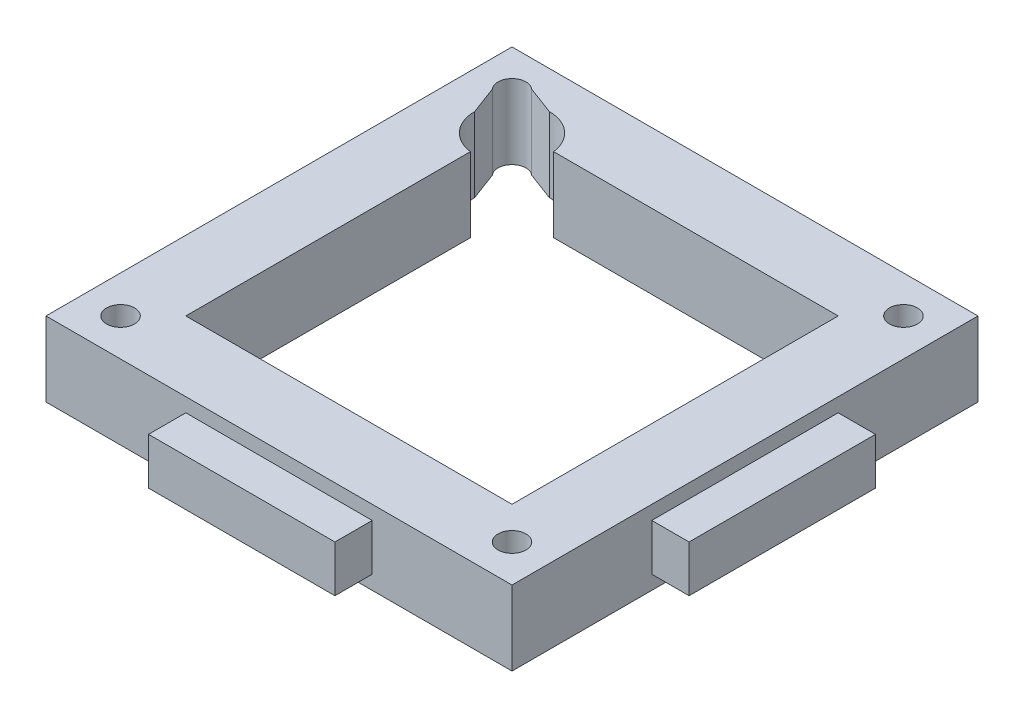
ISO-10303-21;
HEADER;
FILE_DESCRIPTION(('STEP AP214'),'2;1');
FILE_NAME('part.step','',(''),(''),'','','');
FILE_SCHEMA(('AUTOMOTIVE_DESIGN { 1 0 10303 214 1 1 1 1 }'));
ENDSEC;
DATA;
#1=APPLICATION_CONTEXT('core data for automotive mechanical design processes');
#2=APPLICATION_PROTOCOL_DEFINITION('international standard','automotive_design',2000,#1);
#3=PRODUCT_CONTEXT('',#1,'mechanical');
#4=PRODUCT('Part','Part','',(#3));
#5=PRODUCT_RELATED_PRODUCT_CATEGORY('part','',(#4));
#6=PRODUCT_DEFINITION_FORMATION('','',#4);
#7=PRODUCT_DEFINITION_CONTEXT('part definition',#1,'design');
#8=PRODUCT_DEFINITION('design','',#6,#7);
#9=PRODUCT_DEFINITION_SHAPE('','',#8);
#10=(LENGTH_UNIT() NAMED_UNIT(*) SI_UNIT(.MILLI.,.METRE.));
#11=(NAMED_UNIT(*) PLANE_ANGLE_UNIT() SI_UNIT($,.RADIAN.));
#12=(NAMED_UNIT(*) SI_UNIT($,.STERADIAN.) SOLID_ANGLE_UNIT());
#13=UNCERTAINTY_MEASURE_WITH_UNIT(LENGTH_MEASURE(1.E-05),#10,'distance_accuracy_value','');
#14=(GEOMETRIC_REPRESENTATION_CONTEXT(3) GLOBAL_UNCERTAINTY_ASSIGNED_CONTEXT((#13)) GLOBAL_UNIT_ASSIGNED_CONTEXT((#10,
#11,#12)) REPRESENTATION_CONTEXT('',''));
#15=CARTESIAN_POINT('',(0.,0.,0.));
#16=DIRECTION('',(0.,0.,1.));
#17=DIRECTION('',(1.,0.,0.));
#18=AXIS2_PLACEMENT_3D('',#15,#16,#17);
#19=CARTESIAN_POINT('',(25.,8.,0.));
#20=DIRECTION('',(-1.,0.,0.));
#21=DIRECTION('',(0.,0.,1.));
#22=AXIS2_PLACEMENT_3D('',#19,#20,#21);
#23=PLANE('',#22);
#24=DIRECTION('',(0.,0.,-1.));
#25=VECTOR('',#24,1.);
#26=CARTESIAN_POINT('',(25.,0.,0.));
#27=LINE('',#26,#25);
#28=CARTESIAN_POINT('',(25.,0.,25.));
#29=VERTEX_POINT('',#28);
#30=CARTESIAN_POINT('',(25.,0.,-25.));
#31=VERTEX_POINT('',#30);
#32=EDGE_CURVE('E524',#29,#31,#27,.T.);
#33=ORIENTED_EDGE('',*,*,#32,.T.);
#34=DIRECTION('',(0.,-1.,0.));
#35=VECTOR('',#34,1.);
#36=CARTESIAN_POINT('',(25.,8.,-25.));
#37=LINE('',#36,#35);
#38=CARTESIAN_POINT('',(25.,8.,-25.));
#39=VERTEX_POINT('',#38);
#40=EDGE_CURVE('E58',#39,#31,#37,.T.);
#41=ORIENTED_EDGE('',*,*,#40,.F.);
#42=DIRECTION('',(0.,0.,-1.));
#43=VECTOR('',#42,1.);
#44=CARTESIAN_POINT('',(25.,8.,0.));
#45=LINE('',#44,#43);
#46=CARTESIAN_POINT('',(25.,8.,25.));
#47=VERTEX_POINT('',#46);
#48=EDGE_CURVE('E464',#47,#39,#45,.T.);
#49=ORIENTED_EDGE('',*,*,#48,.F.);
#50=DIRECTION('',(0.,-1.,0.));
#51=VECTOR('',#50,1.);
#52=CARTESIAN_POINT('',(25.,8.,25.));
#53=LINE('',#52,#51);
#54=EDGE_CURVE('E11',#47,#29,#53,.T.);
#55=ORIENTED_EDGE('',*,*,#54,.T.);
#56=EDGE_LOOP('',(#33,#41,#49,#55));
#57=FACE_BOUND('',#56,.T.);
#58=DIRECTION('',(0.,0.,-1.));
#59=VECTOR('',#58,1.);
#60=CARTESIAN_POINT('',(25.,1.50000000000004,0.));
#61=LINE('',#60,#59);
#62=CARTESIAN_POINT('',(25.,1.5,10.));
#63=VERTEX_POINT('',#62);
#64=CARTESIAN_POINT('',(25.,1.50000000000007,-10.));
#65=VERTEX_POINT('',#64);
#66=EDGE_CURVE('E74',#63,#65,#61,.T.);
#67=ORIENTED_EDGE('',*,*,#66,.F.);
#68=DIRECTION('',(0.,-1.,0.));
#69=VECTOR('',#68,1.);
#70=CARTESIAN_POINT('',(25.,8.,10.));
#71=LINE('',#70,#69);
#72=CARTESIAN_POINT('',(25.,6.5,10.));
#73=VERTEX_POINT('',#72);
#74=EDGE_CURVE('E297',#73,#63,#71,.T.);
#75=ORIENTED_EDGE('',*,*,#74,.F.);
#76=DIRECTION('',(0.,0.,1.));
#77=VECTOR('',#76,1.);
#78=CARTESIAN_POINT('',(25.,6.5,0.));
#79=LINE('',#78,#77);
#80=CARTESIAN_POINT('',(25.,6.5,-10.));
#81=VERTEX_POINT('',#80);
#82=EDGE_CURVE('E313',#81,#73,#79,.T.);
#83=ORIENTED_EDGE('',*,*,#82,.F.);
#84=DIRECTION('',(0.,1.,0.));
#85=VECTOR('',#84,1.);
#86=CARTESIAN_POINT('',(25.,8.,-10.));
#87=LINE('',#86,#85);
#88=EDGE_CURVE('E309',#65,#81,#87,.T.);
#89=ORIENTED_EDGE('',*,*,#88,.F.);
#90=EDGE_LOOP('',(#67,#75,#83,#89));
#91=FACE_BOUND('',#90,.T.);
#92=ADVANCED_FACE('F48',(#57,#91),#23,.F.);
#93=CARTESIAN_POINT('',(0.,8.,25.));
#94=DIRECTION('',(0.,0.,-1.));
#95=DIRECTION('',(-1.,0.,0.));
#96=AXIS2_PLACEMENT_3D('',#93,#94,#95);
#97=PLANE('',#96);
#98=DIRECTION('',(1.,0.,0.));
#99=VECTOR('',#98,1.);
#100=CARTESIAN_POINT('',(0.,0.,25.));
#101=LINE('',#100,#99);
#102=CARTESIAN_POINT('',(-25.,0.,25.));
#103=VERTEX_POINT('',#102);
#104=EDGE_CURVE('E520',#103,#29,#101,.T.);
#105=ORIENTED_EDGE('',*,*,#104,.T.);
#106=ORIENTED_EDGE('',*,*,#54,.F.);
#107=DIRECTION('',(1.,0.,0.));
#108=VECTOR('',#107,1.);
#109=CARTESIAN_POINT('',(0.,8.,25.));
#110=LINE('',#109,#108);
#111=CARTESIAN_POINT('',(-25.,8.,25.));
#112=VERTEX_POINT('',#111);
#113=EDGE_CURVE('E460',#112,#47,#110,.T.);
#114=ORIENTED_EDGE('',*,*,#113,.F.);
#115=DIRECTION('',(0.,-1.,0.));
#116=VECTOR('',#115,1.);
#117=CARTESIAN_POINT('',(-25.,8.,25.));
#118=LINE('',#117,#116);
#119=EDGE_CURVE('E543',#112,#103,#118,.T.);
#120=ORIENTED_EDGE('',*,*,#119,.T.);
#121=EDGE_LOOP('',(#105,#106,#114,#120));
#122=FACE_BOUND('',#121,.T.);
#123=DIRECTION('',(1.,0.,0.));
#124=VECTOR('',#123,1.);
#125=CARTESIAN_POINT('',(0.,1.5000000000053,25.));
#126=LINE('',#125,#124);
#127=CARTESIAN_POINT('',(-10.0000000000553,1.5000000000053,25.));
#128=VERTEX_POINT('',#127);
#129=CARTESIAN_POINT('',(9.9999999999447,1.5000000000053,25.));
#130=VERTEX_POINT('',#129);
#131=EDGE_CURVE('E334',#128,#130,#126,.T.);
#132=ORIENTED_EDGE('',*,*,#131,.F.);
#133=DIRECTION('',(0.,-1.,0.));
#134=VECTOR('',#133,1.);
#135=CARTESIAN_POINT('',(-10.0000000000553,8.,25.));
#136=LINE('',#135,#134);
#137=CARTESIAN_POINT('',(-10.0000000000553,6.5000000000053,25.));
#138=VERTEX_POINT('',#137);
#139=EDGE_CURVE('E340',#138,#128,#136,.T.);
#140=ORIENTED_EDGE('',*,*,#139,.F.);
#141=DIRECTION('',(-1.,0.,0.));
#142=VECTOR('',#141,1.);
#143=CARTESIAN_POINT('',(0.,6.5000000000053,25.));
#144=LINE('',#143,#142);
#145=CARTESIAN_POINT('',(9.9999999999447,6.5000000000053,25.));
#146=VERTEX_POINT('',#145);
#147=EDGE_CURVE('E357',#146,#138,#144,.T.);
#148=ORIENTED_EDGE('',*,*,#147,.F.);
#149=DIRECTION('',(0.,1.,0.));
#150=VECTOR('',#149,1.);
#151=CARTESIAN_POINT('',(9.9999999999447,8.,25.));
#152=LINE('',#151,#150);
#153=EDGE_CURVE('E353',#130,#146,#152,.T.);
#154=ORIENTED_EDGE('',*,*,#153,.F.);
#155=EDGE_LOOP('',(#132,#140,#148,#154));
#156=FACE_BOUND('',#155,.T.);
#157=ADVANCED_FACE('F631',(#122,#156),#97,.F.);
#158=CARTESIAN_POINT('',(0.,8.,-25.));
#159=DIRECTION('',(0.,0.,-1.));
#160=DIRECTION('',(-1.,0.,0.));
#161=AXIS2_PLACEMENT_3D('',#158,#159,#160);
#162=PLANE('',#161);
#163=DIRECTION('',(1.,0.,0.));
#164=VECTOR('',#163,1.);
#165=CARTESIAN_POINT('',(0.,6.5000000000053,-25.));
#166=LINE('',#165,#164);
#167=CARTESIAN_POINT('',(-10.0000000000553,6.5000000000053,-25.));
#168=VERTEX_POINT('',#167);
#169=CARTESIAN_POINT('',(9.9999999999447,6.5000000000053,-25.));
#170=VERTEX_POINT('',#169);
#171=EDGE_CURVE('E379',#168,#170,#166,.T.);
#172=ORIENTED_EDGE('',*,*,#171,.F.);
#173=DIRECTION('',(0.,1.,0.));
#174=VECTOR('',#173,1.);
#175=CARTESIAN_POINT('',(-10.0000000000553,8.,-25.));
#176=LINE('',#175,#174);
#177=CARTESIAN_POINT('',(-10.0000000000553,1.5000000000053,-25.));
#178=VERTEX_POINT('',#177);
#179=EDGE_CURVE('E385',#178,#168,#176,.T.);
#180=ORIENTED_EDGE('',*,*,#179,.F.);
#181=DIRECTION('',(-1.,0.,0.));
#182=VECTOR('',#181,1.);
#183=CARTESIAN_POINT('',(0.,1.5000000000053,-25.));
#184=LINE('',#183,#182);
#185=CARTESIAN_POINT('',(9.9999999999447,1.5000000000053,-25.));
#186=VERTEX_POINT('',#185);
#187=EDGE_CURVE('E404',#186,#178,#184,.T.);
#188=ORIENTED_EDGE('',*,*,#187,.F.);
#189=DIRECTION('',(0.,-1.,0.));
#190=VECTOR('',#189,1.);
#191=CARTESIAN_POINT('',(9.9999999999447,8.,-25.));
#192=LINE('',#191,#190);
#193=EDGE_CURVE('E400',#170,#186,#192,.T.);
#194=ORIENTED_EDGE('',*,*,#193,.F.);
#195=EDGE_LOOP('',(#172,#180,#188,#194));
#196=FACE_BOUND('',#195,.T.);
#197=DIRECTION('',(1.,0.,0.));
#198=VECTOR('',#197,1.);
#199=CARTESIAN_POINT('',(0.,0.,-25.));
#200=LINE('',#199,#198);
#201=CARTESIAN_POINT('',(-25.,0.,-25.));
#202=VERTEX_POINT('',#201);
#203=EDGE_CURVE('E528',#202,#31,#200,.T.);
#204=ORIENTED_EDGE('',*,*,#203,.F.);
#205=DIRECTION('',(0.,-1.,0.));
#206=VECTOR('',#205,1.);
#207=CARTESIAN_POINT('',(-25.,8.,-25.));
#208=LINE('',#207,#206);
#209=CARTESIAN_POINT('',(-25.,8.,-25.));
#210=VERTEX_POINT('',#209);
#211=EDGE_CURVE('E546',#210,#202,#208,.T.);
#212=ORIENTED_EDGE('',*,*,#211,.F.);
#213=DIRECTION('',(1.,0.,0.));
#214=VECTOR('',#213,1.);
#215=CARTESIAN_POINT('',(0.,8.,-25.));
#216=LINE('',#215,#214);
#217=EDGE_CURVE('E467',#210,#39,#216,.T.);
#218=ORIENTED_EDGE('',*,*,#217,.T.);
#219=ORIENTED_EDGE('',*,*,#40,.T.);
#220=EDGE_LOOP('',(#204,#212,#218,#219));
#221=FACE_BOUND('',#220,.T.);
#222=ADVANCED_FACE('F629',(#196,#221),#162,.T.);
#223=CARTESIAN_POINT('',(-17.,8.,-17.));
#224=DIRECTION('',(0.,-1.,0.));
#225=DIRECTION('',(0.,0.,-1.));
#226=AXIS2_PLACEMENT_3D('',#223,#224,#225);
#227=CYLINDRICAL_SURFACE('',#226,4.);
#228=CARTESIAN_POINT('',(-17.,0.,-17.));
#229=DIRECTION('',(0.,1.,0.));
#230=DIRECTION('',(0.,0.,1.));
#231=AXIS2_PLACEMENT_3D('',#228,#229,#230);
#232=CIRCLE('',#231,4.);
#233=CARTESIAN_POINT('',(-13.0313730334031,0.,-17.5));
#234=VERTEX_POINT('',#233);
#235=CARTESIAN_POINT('',(-17.,0.,-21.));
#236=VERTEX_POINT('',#235);
#237=EDGE_CURVE('E414',#234,#236,#232,.T.);
#238=ORIENTED_EDGE('',*,*,#237,.F.);
#239=DIRECTION('',(0.,-1.,0.));
#240=VECTOR('',#239,1.);
#241=CARTESIAN_POINT('',(-13.0313730334031,8.,-17.5));
#242=LINE('',#241,#240);
#243=CARTESIAN_POINT('',(-13.0313730334031,8.,-17.5));
#244=VERTEX_POINT('',#243);
#245=EDGE_CURVE('E52',#244,#234,#242,.T.);
#246=ORIENTED_EDGE('',*,*,#245,.F.);
#247=CARTESIAN_POINT('',(-17.,8.,-17.));
#248=DIRECTION('',(0.,1.,0.));
#249=DIRECTION('',(0.,0.,1.));
#250=AXIS2_PLACEMENT_3D('',#247,#248,#249);
#251=CIRCLE('',#250,4.);
#252=CARTESIAN_POINT('',(-17.,8.,-21.));
#253=VERTEX_POINT('',#252);
#254=EDGE_CURVE('E424',#244,#253,#251,.T.);
#255=ORIENTED_EDGE('',*,*,#254,.T.);
#256=DIRECTION('',(0.,-1.,0.));
#257=VECTOR('',#256,1.);
#258=CARTESIAN_POINT('',(-17.,8.,-21.));
#259=LINE('',#258,#257);
#260=EDGE_CURVE('E483',#253,#236,#259,.T.);
#261=ORIENTED_EDGE('',*,*,#260,.T.);
#262=EDGE_LOOP('',(#238,#246,#255,#261));
#263=FACE_BOUND('',#262,.T.);
#264=ADVANCED_FACE('F581',(#263),#227,.F.);
#265=CARTESIAN_POINT('',(0.,8.,-17.5));
#266=DIRECTION('',(0.,0.,1.));
#267=DIRECTION('',(1.,0.,0.));
#268=AXIS2_PLACEMENT_3D('',#265,#266,#267);
#269=PLANE('',#268);
#270=DIRECTION('',(-1.,0.,0.));
#271=VECTOR('',#270,1.);
#272=CARTESIAN_POINT('',(0.,0.,-17.5));
#273=LINE('',#272,#271);
#274=CARTESIAN_POINT('',(17.5,0.,-17.5));
#275=VERTEX_POINT('',#274);
#276=EDGE_CURVE('E487',#275,#234,#273,.T.);
#277=ORIENTED_EDGE('',*,*,#276,.F.);
#278=DIRECTION('',(0.,-1.,0.));
#279=VECTOR('',#278,1.);
#280=CARTESIAN_POINT('',(17.5,8.,-17.5));
#281=LINE('',#280,#279);
#282=CARTESIAN_POINT('',(17.5,8.,-17.5));
#283=VERTEX_POINT('',#282);
#284=EDGE_CURVE('E570',#283,#275,#281,.T.);
#285=ORIENTED_EDGE('',*,*,#284,.F.);
#286=DIRECTION('',(-1.,0.,0.));
#287=VECTOR('',#286,1.);
#288=CARTESIAN_POINT('',(0.,8.,-17.5));
#289=LINE('',#288,#287);
#290=EDGE_CURVE('E428',#283,#244,#289,.T.);
#291=ORIENTED_EDGE('',*,*,#290,.T.);
#292=ORIENTED_EDGE('',*,*,#245,.T.);
#293=EDGE_LOOP('',(#277,#285,#291,#292));
#294=FACE_BOUND('',#293,.T.);
#295=ADVANCED_FACE('F50',(#294),#269,.T.);
#296=CARTESIAN_POINT('',(17.5,8.,0.));
#297=DIRECTION('',(-1.,0.,0.));
#298=DIRECTION('',(0.,0.,1.));
#299=AXIS2_PLACEMENT_3D('',#296,#297,#298);
#300=PLANE('',#299);
#301=DIRECTION('',(0.,0.,-1.));
#302=VECTOR('',#301,1.);
#303=CARTESIAN_POINT('',(17.5,0.,0.));
#304=LINE('',#303,#302);
#305=CARTESIAN_POINT('',(17.5,0.,17.5));
#306=VERTEX_POINT('',#305);
#307=EDGE_CURVE('E492',#306,#275,#304,.T.);
#308=ORIENTED_EDGE('',*,*,#307,.F.);
#309=DIRECTION('',(0.,-1.,0.));
#310=VECTOR('',#309,1.);
#311=CARTESIAN_POINT('',(17.5,8.,17.5));
#312=LINE('',#311,#310);
#313=CARTESIAN_POINT('',(17.5,8.,17.5));
#314=VERTEX_POINT('',#313);
#315=EDGE_CURVE('E568',#314,#306,#312,.T.);
#316=ORIENTED_EDGE('',*,*,#315,.F.);
#317=DIRECTION('',(0.,0.,-1.));
#318=VECTOR('',#317,1.);
#319=CARTESIAN_POINT('',(17.5,8.,0.));
#320=LINE('',#319,#318);
#321=EDGE_CURVE('E434',#314,#283,#320,.T.);
#322=ORIENTED_EDGE('',*,*,#321,.T.);
#323=ORIENTED_EDGE('',*,*,#284,.T.);
#324=EDGE_LOOP('',(#308,#316,#322,#323));
#325=FACE_BOUND('',#324,.T.);
#326=ADVANCED_FACE('F589',(#325),#300,.T.);
#327=CARTESIAN_POINT('',(0.,8.,17.5));
#328=DIRECTION('',(0.,0.,-1.));
#329=DIRECTION('',(-1.,0.,0.));
#330=AXIS2_PLACEMENT_3D('',#327,#328,#329);
#331=PLANE('',#330);
#332=DIRECTION('',(1.,0.,0.));
#333=VECTOR('',#332,1.);
#334=CARTESIAN_POINT('',(0.,0.,17.5));
#335=LINE('',#334,#333);
#336=CARTESIAN_POINT('',(-17.5,0.,17.5));
#337=VERTEX_POINT('',#336);
#338=EDGE_CURVE('E496',#337,#306,#335,.T.);
#339=ORIENTED_EDGE('',*,*,#338,.F.);
#340=DIRECTION('',(0.,-1.,0.));
#341=VECTOR('',#340,1.);
#342=CARTESIAN_POINT('',(-17.5,8.,17.5));
#343=LINE('',#342,#341);
#344=CARTESIAN_POINT('',(-17.5,8.,17.5));
#345=VERTEX_POINT('',#344);
#346=EDGE_CURVE('E565',#345,#337,#343,.T.);
#347=ORIENTED_EDGE('',*,*,#346,.F.);
#348=DIRECTION('',(1.,0.,0.));
#349=VECTOR('',#348,1.);
#350=CARTESIAN_POINT('',(0.,8.,17.5));
#351=LINE('',#350,#349);
#352=EDGE_CURVE('E438',#345,#314,#351,.T.);
#353=ORIENTED_EDGE('',*,*,#352,.T.);
#354=ORIENTED_EDGE('',*,*,#315,.T.);
#355=EDGE_LOOP('',(#339,#347,#353,#354));
#356=FACE_BOUND('',#355,.T.);
#357=ADVANCED_FACE('F596',(#356),#331,.T.);
#358=CARTESIAN_POINT('',(-17.5,8.,0.));
#359=DIRECTION('',(-1.,0.,0.));
#360=DIRECTION('',(0.,0.,1.));
#361=AXIS2_PLACEMENT_3D('',#358,#359,#360);
#362=PLANE('',#361);
#363=DIRECTION('',(0.,0.,-1.));
#364=VECTOR('',#363,1.);
#365=CARTESIAN_POINT('',(-17.5,0.,0.));
#366=LINE('',#365,#364);
#367=CARTESIAN_POINT('',(-17.5,0.,-13.0313730334031));
#368=VERTEX_POINT('',#367);
#369=EDGE_CURVE('E500',#337,#368,#366,.T.);
#370=ORIENTED_EDGE('',*,*,#369,.T.);
#371=DIRECTION('',(0.,-1.,0.));
#372=VECTOR('',#371,1.);
#373=CARTESIAN_POINT('',(-17.5,8.,-13.0313730334031));
#374=LINE('',#373,#372);
#375=CARTESIAN_POINT('',(-17.5,8.,-13.0313730334031));
#376=VERTEX_POINT('',#375);
#377=EDGE_CURVE('E562',#376,#368,#374,.T.);
#378=ORIENTED_EDGE('',*,*,#377,.F.);
#379=DIRECTION('',(0.,0.,-1.));
#380=VECTOR('',#379,1.);
#381=CARTESIAN_POINT('',(-17.5,8.,0.));
#382=LINE('',#381,#380);
#383=EDGE_CURVE('E442',#345,#376,#382,.T.);
#384=ORIENTED_EDGE('',*,*,#383,.F.);
#385=ORIENTED_EDGE('',*,*,#346,.T.);
#386=EDGE_LOOP('',(#370,#378,#384,#385));
#387=FACE_BOUND('',#386,.T.);
#388=ADVANCED_FACE('F600',(#387),#362,.F.);
#389=CARTESIAN_POINT('',(-21.,0.,-17.));
#390=VERTEX_POINT('',#389);
#391=EDGE_CURVE('E488',#390,#368,#232,.T.);
#392=ORIENTED_EDGE('',*,*,#391,.F.);
#393=DIRECTION('',(0.,-1.,0.));
#394=VECTOR('',#393,1.);
#395=CARTESIAN_POINT('',(-21.,8.,-17.));
#396=LINE('',#395,#394);
#397=CARTESIAN_POINT('',(-21.,8.,-17.));
#398=VERTEX_POINT('',#397);
#399=EDGE_CURVE('E559',#398,#390,#396,.T.);
#400=ORIENTED_EDGE('',*,*,#399,.F.);
#401=EDGE_CURVE('E430',#398,#376,#251,.T.);
#402=ORIENTED_EDGE('',*,*,#401,.T.);
#403=ORIENTED_EDGE('',*,*,#377,.T.);
#404=EDGE_LOOP('',(#392,#400,#402,#403));
#405=FACE_BOUND('',#404,.T.);
#406=ADVANCED_FACE('F619',(#405),#227,.F.);
#407=CARTESIAN_POINT('',(-12.8219178082192,8.,4.80821917808219));
#408=DIRECTION('',(0.936329177569045,0.,-0.351123441588392));
#409=DIRECTION('',(-0.351123441588392,0.,-0.936329177569045));
#410=AXIS2_PLACEMENT_3D('',#407,#408,#409);
#411=PLANE('',#410);
#412=DIRECTION('',(0.351123441588392,0.,0.936329177569044));
#413=VECTOR('',#412,1.);
#414=CARTESIAN_POINT('',(-12.8219178082192,0.,4.80821917808219));
#415=LINE('',#414,#413);
#416=CARTESIAN_POINT('',(-22.1301369863014,0.,-20.013698630137));
#417=VERTEX_POINT('',#416);
#418=EDGE_CURVE('E504',#417,#390,#415,.T.);
#419=ORIENTED_EDGE('',*,*,#418,.F.);
#420=DIRECTION('',(0.,-1.,0.));
#421=VECTOR('',#420,1.);
#422=CARTESIAN_POINT('',(-22.1301369863014,8.,-20.013698630137));
#423=LINE('',#422,#421);
#424=CARTESIAN_POINT('',(-22.1301369863014,8.,-20.013698630137));
#425=VERTEX_POINT('',#424);
#426=EDGE_CURVE('E556',#425,#417,#423,.T.);
#427=ORIENTED_EDGE('',*,*,#426,.F.);
#428=DIRECTION('',(0.351123441588392,0.,0.936329177569044));
#429=VECTOR('',#428,1.);
#430=CARTESIAN_POINT('',(-12.8219178082192,8.,4.80821917808219));
#431=LINE('',#430,#429);
#432=EDGE_CURVE('E445',#425,#398,#431,.T.);
#433=ORIENTED_EDGE('',*,*,#432,.T.);
#434=ORIENTED_EDGE('',*,*,#399,.T.);
#435=EDGE_LOOP('',(#419,#427,#433,#434));
#436=FACE_BOUND('',#435,.T.);
#437=ADVANCED_FACE('F609',(#436),#411,.T.);
#438=CARTESIAN_POINT('',(-21.,8.,-21.));
#439=DIRECTION('',(0.,-1.,0.));
#440=DIRECTION('',(0.,0.,-1.));
#441=AXIS2_PLACEMENT_3D('',#438,#439,#440);
#442=CYLINDRICAL_SURFACE('',#441,1.5);
#443=CARTESIAN_POINT('',(-21.,0.,-21.));
#444=DIRECTION('',(0.,1.,0.));
#445=DIRECTION('',(0.,0.,1.));
#446=AXIS2_PLACEMENT_3D('',#443,#444,#445);
#447=CIRCLE('',#446,1.5);
#448=CARTESIAN_POINT('',(-20.013698630137,0.,-22.1301369863014));
#449=VERTEX_POINT('',#448);
#450=EDGE_CURVE('E508',#449,#417,#447,.T.);
#451=ORIENTED_EDGE('',*,*,#450,.F.);
#452=DIRECTION('',(0.,-1.,0.));
#453=VECTOR('',#452,1.);
#454=CARTESIAN_POINT('',(-20.013698630137,8.,-22.1301369863014));
#455=LINE('',#454,#453);
#456=CARTESIAN_POINT('',(-20.013698630137,8.,-22.1301369863014));
#457=VERTEX_POINT('',#456);
#458=EDGE_CURVE('E553',#457,#449,#455,.T.);
#459=ORIENTED_EDGE('',*,*,#458,.F.);
#460=CARTESIAN_POINT('',(-21.,8.,-21.));
#461=DIRECTION('',(0.,1.,0.));
#462=DIRECTION('',(0.,0.,1.));
#463=AXIS2_PLACEMENT_3D('',#460,#461,#462);
#464=CIRCLE('',#463,1.5);
#465=EDGE_CURVE('E449',#457,#425,#464,.T.);
#466=ORIENTED_EDGE('',*,*,#465,.T.);
#467=ORIENTED_EDGE('',*,*,#426,.T.);
#468=EDGE_LOOP('',(#451,#459,#466,#467));
#469=FACE_BOUND('',#468,.T.);
#470=ADVANCED_FACE('F613',(#469),#442,.F.);
#471=CARTESIAN_POINT('',(21.,8.,21.));
#472=DIRECTION('',(0.,-1.,0.));
#473=DIRECTION('',(0.,0.,-1.));
#474=AXIS2_PLACEMENT_3D('',#471,#472,#473);
#475=CYLINDRICAL_SURFACE('',#474,1.5);
#476=CARTESIAN_POINT('',(21.,8.,21.));
#477=DIRECTION('',(0.,1.,0.));
#478=DIRECTION('',(0.,0.,1.));
#479=AXIS2_PLACEMENT_3D('',#476,#477,#478);
#480=CIRCLE('',#479,1.5);
#481=CARTESIAN_POINT('',(21.,8.,22.5));
#482=VERTEX_POINT('',#481);
#483=EDGE_CURVE('E475',#482,#482,#480,.T.);
#484=ORIENTED_EDGE('',*,*,#483,.T.);
#485=EDGE_LOOP('',(#484));
#486=FACE_BOUND('',#485,.T.);
#487=CARTESIAN_POINT('',(21.,0.,21.));
#488=DIRECTION('',(0.,1.,0.));
#489=DIRECTION('',(0.,0.,1.));
#490=AXIS2_PLACEMENT_3D('',#487,#488,#489);
#491=CIRCLE('',#490,1.5);
#492=CARTESIAN_POINT('',(21.,0.,22.5));
#493=VERTEX_POINT('',#492);
#494=EDGE_CURVE('E536',#493,#493,#491,.T.);
#495=ORIENTED_EDGE('',*,*,#494,.F.);
#496=EDGE_LOOP('',(#495));
#497=FACE_BOUND('',#496,.T.);
#498=ADVANCED_FACE('F653',(#486,#497),#475,.F.);
#499=CARTESIAN_POINT('',(-25.,8.,0.));
#500=DIRECTION('',(-1.,0.,0.));
#501=DIRECTION('',(0.,0.,1.));
#502=AXIS2_PLACEMENT_3D('',#499,#500,#501);
#503=PLANE('',#502);
#504=DIRECTION('',(0.,0.,-1.));
#505=VECTOR('',#504,1.);
#506=CARTESIAN_POINT('',(-25.,6.5,0.));
#507=LINE('',#506,#505);
#508=CARTESIAN_POINT('',(-25.,6.5,10.));
#509=VERTEX_POINT('',#508);
#510=CARTESIAN_POINT('',(-25.,6.5,-10.));
#511=VERTEX_POINT('',#510);
#512=EDGE_CURVE('E66',#509,#511,#507,.T.);
#513=ORIENTED_EDGE('',*,*,#512,.F.);
#514=DIRECTION('',(0.,1.,0.));
#515=VECTOR('',#514,1.);
#516=CARTESIAN_POINT('',(-25.,8.,10.));
#517=LINE('',#516,#515);
#518=CARTESIAN_POINT('',(-25.,1.5,10.));
#519=VERTEX_POINT('',#518);
#520=EDGE_CURVE('E265',#519,#509,#517,.T.);
#521=ORIENTED_EDGE('',*,*,#520,.F.);
#522=DIRECTION('',(0.,0.,1.));
#523=VECTOR('',#522,1.);
#524=CARTESIAN_POINT('',(-25.,1.50000000000004,0.));
#525=LINE('',#524,#523);
#526=CARTESIAN_POINT('',(-25.,1.50000000000007,-10.));
#527=VERTEX_POINT('',#526);
#528=EDGE_CURVE('E269',#527,#519,#525,.T.);
#529=ORIENTED_EDGE('',*,*,#528,.F.);
#530=DIRECTION('',(0.,-1.,0.));
#531=VECTOR('',#530,1.);
#532=CARTESIAN_POINT('',(-25.,8.,-10.));
#533=LINE('',#532,#531);
#534=EDGE_CURVE('E278',#511,#527,#533,.T.);
#535=ORIENTED_EDGE('',*,*,#534,.F.);
#536=EDGE_LOOP('',(#513,#521,#529,#535));
#537=FACE_BOUND('',#536,.T.);
#538=DIRECTION('',(0.,0.,-1.));
#539=VECTOR('',#538,1.);
#540=CARTESIAN_POINT('',(-25.,0.,0.));
#541=LINE('',#540,#539);
#542=EDGE_CURVE('E532',#103,#202,#541,.T.);
#543=ORIENTED_EDGE('',*,*,#542,.F.);
#544=ORIENTED_EDGE('',*,*,#119,.F.);
#545=DIRECTION('',(0.,0.,-1.));
#546=VECTOR('',#545,1.);
#547=CARTESIAN_POINT('',(-25.,8.,0.));
#548=LINE('',#547,#546);
#549=EDGE_CURVE('E471',#112,#210,#548,.T.);
#550=ORIENTED_EDGE('',*,*,#549,.T.);
#551=ORIENTED_EDGE('',*,*,#211,.T.);
#552=EDGE_LOOP('',(#543,#544,#550,#551));
#553=FACE_BOUND('',#552,.T.);
#554=ADVANCED_FACE('F647',(#537,#553),#503,.T.);
#555=CARTESIAN_POINT('',(21.,8.,-21.));
#556=DIRECTION('',(0.,-1.,0.));
#557=DIRECTION('',(0.,0.,-1.));
#558=AXIS2_PLACEMENT_3D('',#555,#556,#557);
#559=CYLINDRICAL_SURFACE('',#558,1.5);
#560=CARTESIAN_POINT('',(21.,8.,-21.));
#561=DIRECTION('',(0.,1.,0.));
#562=DIRECTION('',(0.,0.,1.));
#563=AXIS2_PLACEMENT_3D('',#560,#561,#562);
#564=CIRCLE('',#563,1.5);
#565=CARTESIAN_POINT('',(21.,8.,-19.5));
#566=VERTEX_POINT('',#565);
#567=EDGE_CURVE('E456',#566,#566,#564,.F.);
#568=ORIENTED_EDGE('',*,*,#567,.F.);
#569=EDGE_LOOP('',(#568));
#570=FACE_BOUND('',#569,.T.);
#571=CARTESIAN_POINT('',(21.,0.,-21.));
#572=DIRECTION('',(0.,1.,0.));
#573=DIRECTION('',(0.,0.,1.));
#574=AXIS2_PLACEMENT_3D('',#571,#572,#573);
#575=CIRCLE('',#574,1.5);
#576=CARTESIAN_POINT('',(21.,0.,-19.5));
#577=VERTEX_POINT('',#576);
#578=EDGE_CURVE('E516',#577,#577,#575,.F.);
#579=ORIENTED_EDGE('',*,*,#578,.T.);
#580=EDGE_LOOP('',(#579));
#581=FACE_BOUND('',#580,.T.);
#582=ADVANCED_FACE('F644',(#570,#581),#559,.F.);
#583=CARTESIAN_POINT('',(4.80821917808219,8.,-12.8219178082192));
#584=DIRECTION('',(0.351123441588392,0.,-0.936329177569045));
#585=DIRECTION('',(-0.936329177569045,0.,-0.351123441588392));
#586=AXIS2_PLACEMENT_3D('',#583,#584,#585);
#587=PLANE('',#586);
#588=DIRECTION('',(0.936329177569044,0.,0.351123441588392));
#589=VECTOR('',#588,1.);
#590=CARTESIAN_POINT('',(4.80821917808219,0.,-12.8219178082192));
#591=LINE('',#590,#589);
#592=EDGE_CURVE('E512',#449,#236,#591,.T.);
#593=ORIENTED_EDGE('',*,*,#592,.T.);
#594=ORIENTED_EDGE('',*,*,#260,.F.);
#595=DIRECTION('',(0.936329177569044,0.,0.351123441588392));
#596=VECTOR('',#595,1.);
#597=CARTESIAN_POINT('',(4.80821917808219,8.,-12.8219178082192));
#598=LINE('',#597,#596);
#599=EDGE_CURVE('E453',#457,#253,#598,.T.);
#600=ORIENTED_EDGE('',*,*,#599,.F.);
#601=ORIENTED_EDGE('',*,*,#458,.T.);
#602=EDGE_LOOP('',(#593,#594,#600,#601));
#603=FACE_BOUND('',#602,.T.);
#604=ADVANCED_FACE('F616',(#603),#587,.F.);
#605=CARTESIAN_POINT('',(-21.,8.,21.));
#606=DIRECTION('',(0.,-1.,0.));
#607=DIRECTION('',(0.,0.,-1.));
#608=AXIS2_PLACEMENT_3D('',#605,#606,#607);
#609=CYLINDRICAL_SURFACE('',#608,1.5);
#610=CARTESIAN_POINT('',(-21.,8.,21.));
#611=DIRECTION('',(0.,1.,0.));
#612=DIRECTION('',(0.,0.,1.));
#613=AXIS2_PLACEMENT_3D('',#610,#611,#612);
#614=CIRCLE('',#613,1.5);
#615=CARTESIAN_POINT('',(-21.,8.,22.5));
#616=VERTEX_POINT('',#615);
#617=EDGE_CURVE('E479',#616,#616,#614,.F.);
#618=ORIENTED_EDGE('',*,*,#617,.F.);
#619=EDGE_LOOP('',(#618));
#620=FACE_BOUND('',#619,.T.);
#621=CARTESIAN_POINT('',(-21.,0.,21.));
#622=DIRECTION('',(0.,1.,0.));
#623=DIRECTION('',(0.,0.,1.));
#624=AXIS2_PLACEMENT_3D('',#621,#622,#623);
#625=CIRCLE('',#624,1.5);
#626=CARTESIAN_POINT('',(-21.,0.,22.5));
#627=VERTEX_POINT('',#626);
#628=EDGE_CURVE('E429',#627,#627,#625,.F.);
#629=ORIENTED_EDGE('',*,*,#628,.T.);
#630=EDGE_LOOP('',(#629));
#631=FACE_BOUND('',#630,.T.);
#632=ADVANCED_FACE('F651',(#620,#631),#609,.F.);
#633=CARTESIAN_POINT('',(0.,8.,0.));
#634=DIRECTION('',(0.,1.,0.));
#635=DIRECTION('',(0.,0.,1.));
#636=AXIS2_PLACEMENT_3D('',#633,#634,#635);
#637=PLANE('',#636);
#638=ORIENTED_EDGE('',*,*,#254,.F.);
#639=ORIENTED_EDGE('',*,*,#290,.F.);
#640=ORIENTED_EDGE('',*,*,#321,.F.);
#641=ORIENTED_EDGE('',*,*,#352,.F.);
#642=ORIENTED_EDGE('',*,*,#383,.T.);
#643=ORIENTED_EDGE('',*,*,#401,.F.);
#644=ORIENTED_EDGE('',*,*,#432,.F.);
#645=ORIENTED_EDGE('',*,*,#465,.F.);
#646=ORIENTED_EDGE('',*,*,#599,.T.);
#647=EDGE_LOOP('',(#638,#639,#640,#641,#642,#643,#644,#645,#646));
#648=FACE_BOUND('',#647,.T.);
#649=ORIENTED_EDGE('',*,*,#567,.T.);
#650=EDGE_LOOP('',(#649));
#651=FACE_BOUND('',#650,.T.);
#652=ORIENTED_EDGE('',*,*,#113,.T.);
#653=ORIENTED_EDGE('',*,*,#48,.T.);
#654=ORIENTED_EDGE('',*,*,#217,.F.);
#655=ORIENTED_EDGE('',*,*,#549,.F.);
#656=EDGE_LOOP('',(#652,#653,#654,#655));
#657=FACE_BOUND('',#656,.T.);
#658=ORIENTED_EDGE('',*,*,#483,.F.);
#659=EDGE_LOOP('',(#658));
#660=FACE_BOUND('',#659,.T.);
#661=ORIENTED_EDGE('',*,*,#617,.T.);
#662=EDGE_LOOP('',(#661));
#663=FACE_BOUND('',#662,.T.);
#664=ADVANCED_FACE('F594',(#648,#651,#657,#660,#663),#637,.T.);
#665=CARTESIAN_POINT('',(0.,0.,0.));
#666=DIRECTION('',(0.,1.,0.));
#667=DIRECTION('',(0.,0.,1.));
#668=AXIS2_PLACEMENT_3D('',#665,#666,#667);
#669=PLANE('',#668);
#670=ORIENTED_EDGE('',*,*,#237,.T.);
#671=ORIENTED_EDGE('',*,*,#592,.F.);
#672=ORIENTED_EDGE('',*,*,#450,.T.);
#673=ORIENTED_EDGE('',*,*,#418,.T.);
#674=ORIENTED_EDGE('',*,*,#391,.T.);
#675=ORIENTED_EDGE('',*,*,#369,.F.);
#676=ORIENTED_EDGE('',*,*,#338,.T.);
#677=ORIENTED_EDGE('',*,*,#307,.T.);
#678=ORIENTED_EDGE('',*,*,#276,.T.);
#679=EDGE_LOOP('',(#670,#671,#672,#673,#674,#675,#676,#677,#678));
#680=FACE_BOUND('',#679,.T.);
#681=ORIENTED_EDGE('',*,*,#578,.F.);
#682=EDGE_LOOP('',(#681));
#683=FACE_BOUND('',#682,.T.);
#684=ORIENTED_EDGE('',*,*,#104,.F.);
#685=ORIENTED_EDGE('',*,*,#542,.T.);
#686=ORIENTED_EDGE('',*,*,#203,.T.);
#687=ORIENTED_EDGE('',*,*,#32,.F.);
#688=EDGE_LOOP('',(#684,#685,#686,#687));
#689=FACE_BOUND('',#688,.T.);
#690=ORIENTED_EDGE('',*,*,#494,.T.);
#691=EDGE_LOOP('',(#690));
#692=FACE_BOUND('',#691,.T.);
#693=ORIENTED_EDGE('',*,*,#628,.F.);
#694=EDGE_LOOP('',(#693));
#695=FACE_BOUND('',#694,.T.);
#696=ADVANCED_FACE('F585',(#680,#683,#689,#692,#695),#669,.F.);
#697=CARTESIAN_POINT('',(0.,6.5000000000053,-21.));
#698=DIRECTION('',(0.,1.,0.));
#699=DIRECTION('',(0.,0.,1.));
#700=AXIS2_PLACEMENT_3D('',#697,#698,#699);
#701=PLANE('',#700);
#702=ORIENTED_EDGE('',*,*,#171,.T.);
#703=DIRECTION('',(0.,0.,-1.));
#704=VECTOR('',#703,1.);
#705=CARTESIAN_POINT('',(9.9999999999447,6.5000000000053,-21.));
#706=LINE('',#705,#704);
#707=CARTESIAN_POINT('',(9.9999999999447,6.5000000000053,-21.));
#708=VERTEX_POINT('',#707);
#709=EDGE_CURVE('E397',#708,#170,#706,.T.);
#710=ORIENTED_EDGE('',*,*,#709,.F.);
#711=DIRECTION('',(1.,0.,0.));
#712=VECTOR('',#711,1.);
#713=CARTESIAN_POINT('',(0.,6.5000000000053,-21.));
#714=LINE('',#713,#712);
#715=CARTESIAN_POINT('',(-10.0000000000553,6.5000000000053,-21.));
#716=VERTEX_POINT('',#715);
#717=EDGE_CURVE('E380',#716,#708,#714,.T.);
#718=ORIENTED_EDGE('',*,*,#717,.F.);
#719=DIRECTION('',(0.,0.,-1.));
#720=VECTOR('',#719,1.);
#721=CARTESIAN_POINT('',(-10.0000000000553,6.5000000000053,-21.));
#722=LINE('',#721,#720);
#723=EDGE_CURVE('E411',#716,#168,#722,.T.);
#724=ORIENTED_EDGE('',*,*,#723,.T.);
#725=EDGE_LOOP('',(#702,#710,#718,#724));
#726=FACE_BOUND('',#725,.T.);
#727=ADVANCED_FACE('F671',(#726),#701,.F.);
#728=CARTESIAN_POINT('',(-10.0000000000553,8.,-21.));
#729=DIRECTION('',(-1.,0.,0.));
#730=DIRECTION('',(0.,0.,1.));
#731=AXIS2_PLACEMENT_3D('',#728,#729,#730);
#732=PLANE('',#731);
#733=ORIENTED_EDGE('',*,*,#179,.T.);
#734=ORIENTED_EDGE('',*,*,#723,.F.);
#735=DIRECTION('',(0.,1.,0.));
#736=VECTOR('',#735,1.);
#737=CARTESIAN_POINT('',(-10.0000000000553,8.,-21.));
#738=LINE('',#737,#736);
#739=CARTESIAN_POINT('',(-10.0000000000553,1.5000000000053,-21.));
#740=VERTEX_POINT('',#739);
#741=EDGE_CURVE('E393',#740,#716,#738,.T.);
#742=ORIENTED_EDGE('',*,*,#741,.F.);
#743=DIRECTION('',(0.,0.,-1.));
#744=VECTOR('',#743,1.);
#745=CARTESIAN_POINT('',(-10.0000000000553,1.5000000000053,-21.));
#746=LINE('',#745,#744);
#747=EDGE_CURVE('E415',#740,#178,#746,.T.);
#748=ORIENTED_EDGE('',*,*,#747,.T.);
#749=EDGE_LOOP('',(#733,#734,#742,#748));
#750=FACE_BOUND('',#749,.T.);
#751=ADVANCED_FACE('F676',(#750),#732,.F.);
#752=CARTESIAN_POINT('',(0.,1.5000000000053,-21.));
#753=DIRECTION('',(0.,-1.,0.));
#754=DIRECTION('',(0.,0.,-1.));
#755=AXIS2_PLACEMENT_3D('',#752,#753,#754);
#756=PLANE('',#755);
#757=ORIENTED_EDGE('',*,*,#187,.T.);
#758=ORIENTED_EDGE('',*,*,#747,.F.);
#759=DIRECTION('',(-1.,0.,0.));
#760=VECTOR('',#759,1.);
#761=CARTESIAN_POINT('',(0.,1.5000000000053,-21.));
#762=LINE('',#761,#760);
#763=CARTESIAN_POINT('',(9.9999999999447,1.5000000000053,-21.));
#764=VERTEX_POINT('',#763);
#765=EDGE_CURVE('E389',#764,#740,#762,.T.);
#766=ORIENTED_EDGE('',*,*,#765,.F.);
#767=DIRECTION('',(0.,0.,-1.));
#768=VECTOR('',#767,1.);
#769=CARTESIAN_POINT('',(9.9999999999447,1.5000000000053,-21.));
#770=LINE('',#769,#768);
#771=EDGE_CURVE('E418',#764,#186,#770,.T.);
#772=ORIENTED_EDGE('',*,*,#771,.T.);
#773=EDGE_LOOP('',(#757,#758,#766,#772));
#774=FACE_BOUND('',#773,.T.);
#775=ADVANCED_FACE('F682',(#774),#756,.F.);
#776=CARTESIAN_POINT('',(9.9999999999447,8.,-21.));
#777=DIRECTION('',(1.,0.,0.));
#778=DIRECTION('',(0.,0.,-1.));
#779=AXIS2_PLACEMENT_3D('',#776,#777,#778);
#780=PLANE('',#779);
#781=ORIENTED_EDGE('',*,*,#193,.T.);
#782=ORIENTED_EDGE('',*,*,#771,.F.);
#783=DIRECTION('',(0.,-1.,0.));
#784=VECTOR('',#783,1.);
#785=CARTESIAN_POINT('',(9.9999999999447,8.,-21.));
#786=LINE('',#785,#784);
#787=EDGE_CURVE('E384',#708,#764,#786,.T.);
#788=ORIENTED_EDGE('',*,*,#787,.F.);
#789=ORIENTED_EDGE('',*,*,#709,.T.);
#790=EDGE_LOOP('',(#781,#782,#788,#789));
#791=FACE_BOUND('',#790,.T.);
#792=ADVANCED_FACE('F678',(#791),#780,.F.);
#793=CARTESIAN_POINT('',(0.,0.,-21.));
#794=DIRECTION('',(0.,0.,-1.));
#795=DIRECTION('',(-1.,0.,0.));
#796=AXIS2_PLACEMENT_3D('',#793,#794,#795);
#797=PLANE('',#796);
#798=ORIENTED_EDGE('',*,*,#717,.T.);
#799=ORIENTED_EDGE('',*,*,#787,.T.);
#800=ORIENTED_EDGE('',*,*,#765,.T.);
#801=ORIENTED_EDGE('',*,*,#741,.T.);
#802=EDGE_LOOP('',(#798,#799,#800,#801));
#803=FACE_BOUND('',#802,.T.);
#804=ADVANCED_FACE('F681',(#803),#797,.T.);
#805=CARTESIAN_POINT('',(0.,1.5000000000053,29.));
#806=DIRECTION('',(0.,1.,0.));
#807=DIRECTION('',(0.,0.,1.));
#808=AXIS2_PLACEMENT_3D('',#805,#806,#807);
#809=PLANE('',#808);
#810=ORIENTED_EDGE('',*,*,#131,.T.);
#811=DIRECTION('',(0.,0.,-1.));
#812=VECTOR('',#811,1.);
#813=CARTESIAN_POINT('',(9.9999999999447,1.5000000000053,29.));
#814=LINE('',#813,#812);
#815=CARTESIAN_POINT('',(9.9999999999447,1.5000000000053,29.));
#816=VERTEX_POINT('',#815);
#817=EDGE_CURVE('E375',#816,#130,#814,.T.);
#818=ORIENTED_EDGE('',*,*,#817,.F.);
#819=DIRECTION('',(1.,0.,0.));
#820=VECTOR('',#819,1.);
#821=CARTESIAN_POINT('',(0.,1.5000000000053,29.));
#822=LINE('',#821,#820);
#823=CARTESIAN_POINT('',(-10.0000000000553,1.5000000000053,29.));
#824=VERTEX_POINT('',#823);
#825=EDGE_CURVE('E335',#824,#816,#822,.T.);
#826=ORIENTED_EDGE('',*,*,#825,.F.);
#827=DIRECTION('',(0.,0.,-1.));
#828=VECTOR('',#827,1.);
#829=CARTESIAN_POINT('',(-10.0000000000553,1.5000000000053,29.));
#830=LINE('',#829,#828);
#831=EDGE_CURVE('E349',#824,#128,#830,.T.);
#832=ORIENTED_EDGE('',*,*,#831,.T.);
#833=EDGE_LOOP('',(#810,#818,#826,#832));
#834=FACE_BOUND('',#833,.T.);
#835=ADVANCED_FACE('F692',(#834),#809,.F.);
#836=CARTESIAN_POINT('',(9.9999999999447,8.,29.));
#837=DIRECTION('',(-1.,0.,0.));
#838=DIRECTION('',(0.,0.,1.));
#839=AXIS2_PLACEMENT_3D('',#836,#837,#838);
#840=PLANE('',#839);
#841=ORIENTED_EDGE('',*,*,#153,.T.);
#842=DIRECTION('',(0.,0.,-1.));
#843=VECTOR('',#842,1.);
#844=CARTESIAN_POINT('',(9.9999999999447,6.5000000000053,29.));
#845=LINE('',#844,#843);
#846=CARTESIAN_POINT('',(9.9999999999447,6.5000000000053,29.));
#847=VERTEX_POINT('',#846);
#848=EDGE_CURVE('E371',#847,#146,#845,.T.);
#849=ORIENTED_EDGE('',*,*,#848,.F.);
#850=DIRECTION('',(0.,1.,0.));
#851=VECTOR('',#850,1.);
#852=CARTESIAN_POINT('',(9.9999999999447,8.,29.));
#853=LINE('',#852,#851);
#854=EDGE_CURVE('E339',#816,#847,#853,.T.);
#855=ORIENTED_EDGE('',*,*,#854,.F.);
#856=ORIENTED_EDGE('',*,*,#817,.T.);
#857=EDGE_LOOP('',(#841,#849,#855,#856));
#858=FACE_BOUND('',#857,.T.);
#859=ADVANCED_FACE('F696',(#858),#840,.F.);
#860=CARTESIAN_POINT('',(0.,6.5000000000053,29.));
#861=DIRECTION('',(0.,-1.,0.));
#862=DIRECTION('',(0.,0.,-1.));
#863=AXIS2_PLACEMENT_3D('',#860,#861,#862);
#864=PLANE('',#863);
#865=ORIENTED_EDGE('',*,*,#147,.T.);
#866=DIRECTION('',(0.,0.,-1.));
#867=VECTOR('',#866,1.);
#868=CARTESIAN_POINT('',(-10.0000000000553,6.5000000000053,29.));
#869=LINE('',#868,#867);
#870=CARTESIAN_POINT('',(-10.0000000000553,6.5000000000053,29.));
#871=VERTEX_POINT('',#870);
#872=EDGE_CURVE('E367',#871,#138,#869,.T.);
#873=ORIENTED_EDGE('',*,*,#872,.F.);
#874=DIRECTION('',(-1.,0.,0.));
#875=VECTOR('',#874,1.);
#876=CARTESIAN_POINT('',(0.,6.5000000000053,29.));
#877=LINE('',#876,#875);
#878=EDGE_CURVE('E343',#847,#871,#877,.T.);
#879=ORIENTED_EDGE('',*,*,#878,.F.);
#880=ORIENTED_EDGE('',*,*,#848,.T.);
#881=EDGE_LOOP('',(#865,#873,#879,#880));
#882=FACE_BOUND('',#881,.T.);
#883=ADVANCED_FACE('F700',(#882),#864,.F.);
#884=CARTESIAN_POINT('',(-10.0000000000553,8.,29.));
#885=DIRECTION('',(1.,0.,0.));
#886=DIRECTION('',(0.,0.,-1.));
#887=AXIS2_PLACEMENT_3D('',#884,#885,#886);
#888=PLANE('',#887);
#889=ORIENTED_EDGE('',*,*,#139,.T.);
#890=ORIENTED_EDGE('',*,*,#831,.F.);
#891=DIRECTION('',(0.,-1.,0.));
#892=VECTOR('',#891,1.);
#893=CARTESIAN_POINT('',(-10.0000000000553,8.,29.));
#894=LINE('',#893,#892);
#895=EDGE_CURVE('E346',#871,#824,#894,.T.);
#896=ORIENTED_EDGE('',*,*,#895,.F.);
#897=ORIENTED_EDGE('',*,*,#872,.T.);
#898=EDGE_LOOP('',(#889,#890,#896,#897));
#899=FACE_BOUND('',#898,.T.);
#900=ADVANCED_FACE('F704',(#899),#888,.F.);
#901=CARTESIAN_POINT('',(0.,0.,29.));
#902=DIRECTION('',(0.,0.,1.));
#903=DIRECTION('',(1.,0.,0.));
#904=AXIS2_PLACEMENT_3D('',#901,#902,#903);
#905=PLANE('',#904);
#906=ORIENTED_EDGE('',*,*,#825,.T.);
#907=ORIENTED_EDGE('',*,*,#854,.T.);
#908=ORIENTED_EDGE('',*,*,#878,.T.);
#909=ORIENTED_EDGE('',*,*,#895,.T.);
#910=EDGE_LOOP('',(#906,#907,#908,#909));
#911=FACE_BOUND('',#910,.T.);
#912=ADVANCED_FACE('F708',(#911),#905,.T.);
#913=CARTESIAN_POINT('',(29.,1.50000000000004,0.));
#914=DIRECTION('',(0.,1.,0.));
#915=DIRECTION('',(0.,0.,1.));
#916=AXIS2_PLACEMENT_3D('',#913,#914,#915);
#917=PLANE('',#916);
#918=ORIENTED_EDGE('',*,*,#66,.T.);
#919=DIRECTION('',(-1.,0.,0.));
#920=VECTOR('',#919,1.);
#921=CARTESIAN_POINT('',(29.,1.50000000000007,-10.));
#922=LINE('',#921,#920);
#923=CARTESIAN_POINT('',(29.,1.50000000000007,-10.));
#924=VERTEX_POINT('',#923);
#925=EDGE_CURVE('E330',#924,#65,#922,.T.);
#926=ORIENTED_EDGE('',*,*,#925,.F.);
#927=DIRECTION('',(0.,0.,-1.));
#928=VECTOR('',#927,1.);
#929=CARTESIAN_POINT('',(29.,1.50000000000004,0.));
#930=LINE('',#929,#928);
#931=CARTESIAN_POINT('',(29.,1.5,10.));
#932=VERTEX_POINT('',#931);
#933=EDGE_CURVE('E292',#932,#924,#930,.T.);
#934=ORIENTED_EDGE('',*,*,#933,.F.);
#935=DIRECTION('',(-1.,0.,0.));
#936=VECTOR('',#935,1.);
#937=CARTESIAN_POINT('',(29.,1.5,10.));
#938=LINE('',#937,#936);
#939=EDGE_CURVE('E306',#932,#63,#938,.T.);
#940=ORIENTED_EDGE('',*,*,#939,.T.);
#941=EDGE_LOOP('',(#918,#926,#934,#940));
#942=FACE_BOUND('',#941,.T.);
#943=ADVANCED_FACE('F712',(#942),#917,.F.);
#944=CARTESIAN_POINT('',(29.,8.,-10.));
#945=DIRECTION('',(0.,0.,1.));
#946=DIRECTION('',(1.,0.,0.));
#947=AXIS2_PLACEMENT_3D('',#944,#945,#946);
#948=PLANE('',#947);
#949=ORIENTED_EDGE('',*,*,#88,.T.);
#950=DIRECTION('',(-1.,0.,0.));
#951=VECTOR('',#950,1.);
#952=CARTESIAN_POINT('',(29.,6.5,-10.));
#953=LINE('',#952,#951);
#954=CARTESIAN_POINT('',(29.,6.5,-10.));
#955=VERTEX_POINT('',#954);
#956=EDGE_CURVE('E326',#955,#81,#953,.T.);
#957=ORIENTED_EDGE('',*,*,#956,.F.);
#958=DIRECTION('',(0.,1.,0.));
#959=VECTOR('',#958,1.);
#960=CARTESIAN_POINT('',(29.,8.,-10.));
#961=LINE('',#960,#959);
#962=EDGE_CURVE('E296',#924,#955,#961,.T.);
#963=ORIENTED_EDGE('',*,*,#962,.F.);
#964=ORIENTED_EDGE('',*,*,#925,.T.);
#965=EDGE_LOOP('',(#949,#957,#963,#964));
#966=FACE_BOUND('',#965,.T.);
#967=ADVANCED_FACE('F716',(#966),#948,.F.);
#968=CARTESIAN_POINT('',(29.,6.5,0.));
#969=DIRECTION('',(0.,-1.,0.));
#970=DIRECTION('',(0.,0.,-1.));
#971=AXIS2_PLACEMENT_3D('',#968,#969,#970);
#972=PLANE('',#971);
#973=ORIENTED_EDGE('',*,*,#82,.T.);
#974=DIRECTION('',(-1.,0.,0.));
#975=VECTOR('',#974,1.);
#976=CARTESIAN_POINT('',(29.,6.5,10.));
#977=LINE('',#976,#975);
#978=CARTESIAN_POINT('',(29.,6.5,10.));
#979=VERTEX_POINT('',#978);
#980=EDGE_CURVE('E322',#979,#73,#977,.T.);
#981=ORIENTED_EDGE('',*,*,#980,.F.);
#982=DIRECTION('',(0.,0.,1.));
#983=VECTOR('',#982,1.);
#984=CARTESIAN_POINT('',(29.,6.5,0.));
#985=LINE('',#984,#983);
#986=EDGE_CURVE('E300',#955,#979,#985,.T.);
#987=ORIENTED_EDGE('',*,*,#986,.F.);
#988=ORIENTED_EDGE('',*,*,#956,.T.);
#989=EDGE_LOOP('',(#973,#981,#987,#988));
#990=FACE_BOUND('',#989,.T.);
#991=ADVANCED_FACE('F720',(#990),#972,.F.);
#992=CARTESIAN_POINT('',(29.,8.,10.));
#993=DIRECTION('',(0.,0.,-1.));
#994=DIRECTION('',(-1.,0.,0.));
#995=AXIS2_PLACEMENT_3D('',#992,#993,#994);
#996=PLANE('',#995);
#997=ORIENTED_EDGE('',*,*,#74,.T.);
#998=ORIENTED_EDGE('',*,*,#939,.F.);
#999=DIRECTION('',(0.,-1.,0.));
#1000=VECTOR('',#999,1.);
#1001=CARTESIAN_POINT('',(29.,8.,10.));
#1002=LINE('',#1001,#1000);
#1003=EDGE_CURVE('E303',#979,#932,#1002,.T.);
#1004=ORIENTED_EDGE('',*,*,#1003,.F.);
#1005=ORIENTED_EDGE('',*,*,#980,.T.);
#1006=EDGE_LOOP('',(#997,#998,#1004,#1005));
#1007=FACE_BOUND('',#1006,.T.);
#1008=ADVANCED_FACE('F724',(#1007),#996,.F.);
#1009=CARTESIAN_POINT('',(29.,0.,0.));
#1010=DIRECTION('',(1.,0.,0.));
#1011=DIRECTION('',(0.,0.,-1.));
#1012=AXIS2_PLACEMENT_3D('',#1009,#1010,#1011);
#1013=PLANE('',#1012);
#1014=ORIENTED_EDGE('',*,*,#933,.T.);
#1015=ORIENTED_EDGE('',*,*,#962,.T.);
#1016=ORIENTED_EDGE('',*,*,#986,.T.);
#1017=ORIENTED_EDGE('',*,*,#1003,.T.);
#1018=EDGE_LOOP('',(#1014,#1015,#1016,#1017));
#1019=FACE_BOUND('',#1018,.T.);
#1020=ADVANCED_FACE('F728',(#1019),#1013,.T.);
#1021=CARTESIAN_POINT('',(-21.,6.5,0.));
#1022=DIRECTION('',(0.,1.,0.));
#1023=DIRECTION('',(0.,0.,1.));
#1024=AXIS2_PLACEMENT_3D('',#1021,#1022,#1023);
#1025=PLANE('',#1024);
#1026=ORIENTED_EDGE('',*,*,#512,.T.);
#1027=DIRECTION('',(-1.,0.,0.));
#1028=VECTOR('',#1027,1.);
#1029=CARTESIAN_POINT('',(-21.,6.5,-10.));
#1030=LINE('',#1029,#1028);
#1031=CARTESIAN_POINT('',(-21.,6.5,-10.));
#1032=VERTEX_POINT('',#1031);
#1033=EDGE_CURVE('E240',#1032,#511,#1030,.T.);
#1034=ORIENTED_EDGE('',*,*,#1033,.F.);
#1035=DIRECTION('',(0.,0.,-1.));
#1036=VECTOR('',#1035,1.);
#1037=CARTESIAN_POINT('',(-21.,6.5,0.));
#1038=LINE('',#1037,#1036);
#1039=CARTESIAN_POINT('',(-21.,6.5,10.));
#1040=VERTEX_POINT('',#1039);
#1041=EDGE_CURVE('E244',#1040,#1032,#1038,.T.);
#1042=ORIENTED_EDGE('',*,*,#1041,.F.);
#1043=DIRECTION('',(-1.,0.,0.));
#1044=VECTOR('',#1043,1.);
#1045=CARTESIAN_POINT('',(-21.,6.5,10.));
#1046=LINE('',#1045,#1044);
#1047=EDGE_CURVE('E284',#1040,#509,#1046,.T.);
#1048=ORIENTED_EDGE('',*,*,#1047,.T.);
#1049=EDGE_LOOP('',(#1026,#1034,#1042,#1048));
#1050=FACE_BOUND('',#1049,.T.);
#1051=ADVANCED_FACE('F242',(#1050),#1025,.F.);
#1052=CARTESIAN_POINT('',(-21.,8.,10.));
#1053=DIRECTION('',(0.,0.,1.));
#1054=DIRECTION('',(1.,0.,0.));
#1055=AXIS2_PLACEMENT_3D('',#1052,#1053,#1054);
#1056=PLANE('',#1055);
#1057=ORIENTED_EDGE('',*,*,#520,.T.);
#1058=ORIENTED_EDGE('',*,*,#1047,.F.);
#1059=DIRECTION('',(0.,1.,0.));
#1060=VECTOR('',#1059,1.);
#1061=CARTESIAN_POINT('',(-21.,8.,10.));
#1062=LINE('',#1061,#1060);
#1063=CARTESIAN_POINT('',(-21.,1.5,10.));
#1064=VERTEX_POINT('',#1063);
#1065=EDGE_CURVE('E251',#1064,#1040,#1062,.T.);
#1066=ORIENTED_EDGE('',*,*,#1065,.F.);
#1067=DIRECTION('',(-1.,0.,0.));
#1068=VECTOR('',#1067,1.);
#1069=CARTESIAN_POINT('',(-21.,1.5,10.));
#1070=LINE('',#1069,#1068);
#1071=EDGE_CURVE('E287',#1064,#519,#1070,.T.);
#1072=ORIENTED_EDGE('',*,*,#1071,.T.);
#1073=EDGE_LOOP('',(#1057,#1058,#1066,#1072));
#1074=FACE_BOUND('',#1073,.T.);
#1075=ADVANCED_FACE('F735',(#1074),#1056,.F.);
#1076=CARTESIAN_POINT('',(-21.,1.50000000000004,0.));
#1077=DIRECTION('',(0.,-1.,0.));
#1078=DIRECTION('',(0.,0.,-1.));
#1079=AXIS2_PLACEMENT_3D('',#1076,#1077,#1078);
#1080=PLANE('',#1079);
#1081=ORIENTED_EDGE('',*,*,#528,.T.);
#1082=ORIENTED_EDGE('',*,*,#1071,.F.);
#1083=DIRECTION('',(0.,0.,1.));
#1084=VECTOR('',#1083,1.);
#1085=CARTESIAN_POINT('',(-21.,1.50000000000004,0.));
#1086=LINE('',#1085,#1084);
#1087=CARTESIAN_POINT('',(-21.,1.50000000000007,-10.));
#1088=VERTEX_POINT('',#1087);
#1089=EDGE_CURVE('E260',#1088,#1064,#1086,.T.);
#1090=ORIENTED_EDGE('',*,*,#1089,.F.);
#1091=DIRECTION('',(-1.,0.,0.));
#1092=VECTOR('',#1091,1.);
#1093=CARTESIAN_POINT('',(-21.,1.50000000000007,-10.));
#1094=LINE('',#1093,#1092);
#1095=EDGE_CURVE('E250',#1088,#527,#1094,.T.);
#1096=ORIENTED_EDGE('',*,*,#1095,.T.);
#1097=EDGE_LOOP('',(#1081,#1082,#1090,#1096));
#1098=FACE_BOUND('',#1097,.T.);
#1099=ADVANCED_FACE('F738',(#1098),#1080,.F.);
#1100=CARTESIAN_POINT('',(-21.,8.,-10.));
#1101=DIRECTION('',(0.,0.,-1.));
#1102=DIRECTION('',(-1.,0.,0.));
#1103=AXIS2_PLACEMENT_3D('',#1100,#1101,#1102);
#1104=PLANE('',#1103);
#1105=ORIENTED_EDGE('',*,*,#534,.T.);
#1106=ORIENTED_EDGE('',*,*,#1095,.F.);
#1107=DIRECTION('',(0.,-1.,0.));
#1108=VECTOR('',#1107,1.);
#1109=CARTESIAN_POINT('',(-21.,8.,-10.));
#1110=LINE('',#1109,#1108);
#1111=EDGE_CURVE('E254',#1032,#1088,#1110,.T.);
#1112=ORIENTED_EDGE('',*,*,#1111,.F.);
#1113=ORIENTED_EDGE('',*,*,#1033,.T.);
#1114=EDGE_LOOP('',(#1105,#1106,#1112,#1113));
#1115=FACE_BOUND('',#1114,.T.);
#1116=ADVANCED_FACE('F255',(#1115),#1104,.F.);
#1117=CARTESIAN_POINT('',(-21.,0.,0.));
#1118=DIRECTION('',(-1.,0.,0.));
#1119=DIRECTION('',(0.,0.,1.));
#1120=AXIS2_PLACEMENT_3D('',#1117,#1118,#1119);
#1121=PLANE('',#1120);
#1122=ORIENTED_EDGE('',*,*,#1041,.T.);
#1123=ORIENTED_EDGE('',*,*,#1111,.T.);
#1124=ORIENTED_EDGE('',*,*,#1089,.T.);
#1125=ORIENTED_EDGE('',*,*,#1065,.T.);
#1126=EDGE_LOOP('',(#1122,#1123,#1124,#1125));
#1127=FACE_BOUND('',#1126,.T.);
#1128=ADVANCED_FACE('F262',(#1127),#1121,.T.);
#1129=CLOSED_SHELL('',(#92,#157,#222,#264,#295,#326,#357,#388,#406,#437,#470,#498,#554,#582,
#604,#632,#664,#696,#727,#751,#775,#792,#804,#835,#859,#883,#900,#912,#943,#967,#991,#1008,
#1020,#1051,#1075,#1099,#1116,#1128));
#1130=MANIFOLD_SOLID_BREP('B2',#1129);
#1131=ADVANCED_BREP_SHAPE_REPRESENTATION('',(#18,#1130),#14);
#1132=SHAPE_DEFINITION_REPRESENTATION(#9,#1131);
ENDSEC;
END-ISO-10303-21;
